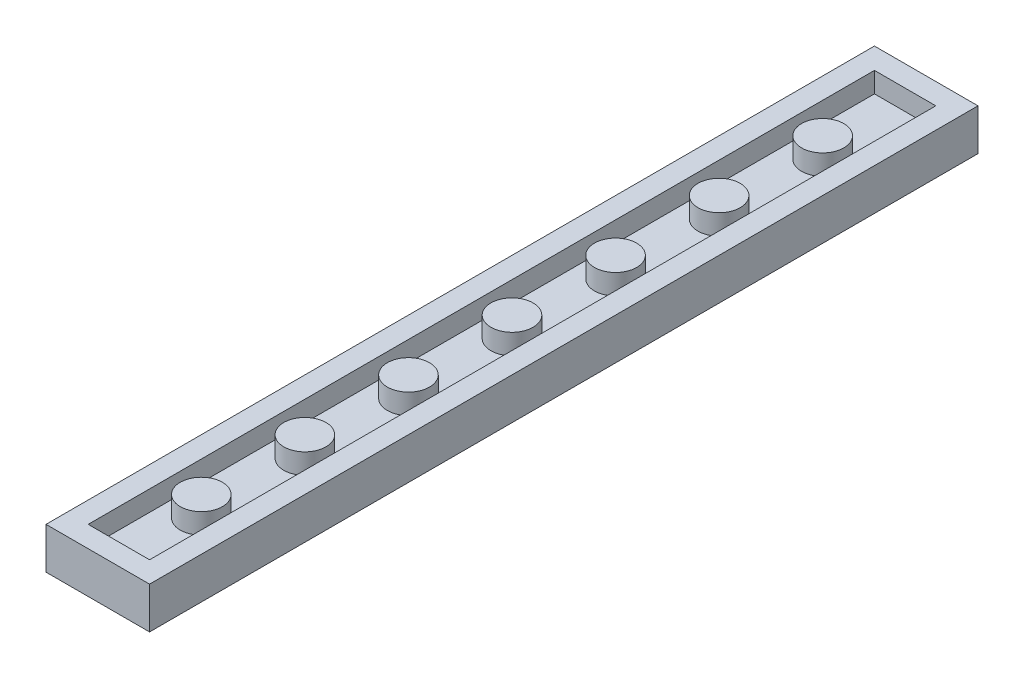
ISO-10303-21;
HEADER;
FILE_DESCRIPTION(('STEP AP214'),'2;1');
FILE_NAME('part.step','',(''),(''),'','','');
FILE_SCHEMA(('AUTOMOTIVE_DESIGN { 1 0 10303 214 1 1 1 1 }'));
ENDSEC;
DATA;
#1=APPLICATION_CONTEXT('core data for automotive mechanical design processes');
#2=APPLICATION_PROTOCOL_DEFINITION('international standard','automotive_design',2000,#1);
#3=PRODUCT_CONTEXT('',#1,'mechanical');
#4=PRODUCT('Part','Part','',(#3));
#5=PRODUCT_RELATED_PRODUCT_CATEGORY('part','',(#4));
#6=PRODUCT_DEFINITION_FORMATION('','',#4);
#7=PRODUCT_DEFINITION_CONTEXT('part definition',#1,'design');
#8=PRODUCT_DEFINITION('design','',#6,#7);
#9=PRODUCT_DEFINITION_SHAPE('','',#8);
#10=(LENGTH_UNIT() NAMED_UNIT(*) SI_UNIT(.MILLI.,.METRE.));
#11=(NAMED_UNIT(*) PLANE_ANGLE_UNIT() SI_UNIT($,.RADIAN.));
#12=(NAMED_UNIT(*) SI_UNIT($,.STERADIAN.) SOLID_ANGLE_UNIT());
#13=UNCERTAINTY_MEASURE_WITH_UNIT(LENGTH_MEASURE(1.E-05),#10,'distance_accuracy_value','');
#14=(GEOMETRIC_REPRESENTATION_CONTEXT(3) GLOBAL_UNCERTAINTY_ASSIGNED_CONTEXT((#13)) GLOBAL_UNIT_ASSIGNED_CONTEXT((#10,
#11,#12)) REPRESENTATION_CONTEXT('',''));
#15=CARTESIAN_POINT('',(0.,0.,0.));
#16=DIRECTION('',(0.,0.,1.));
#17=DIRECTION('',(1.,0.,0.));
#18=AXIS2_PLACEMENT_3D('',#15,#16,#17);
#19=CARTESIAN_POINT('',(-4.0325,0.,16.13));
#20=DIRECTION('',(0.,0.,1.));
#21=DIRECTION('',(1.,0.,0.));
#22=AXIS2_PLACEMENT_3D('',#19,#20,#21);
#23=PLANE('',#22);
#24=DIRECTION('',(1.,0.,0.));
#25=VECTOR('',#24,1.);
#26=CARTESIAN_POINT('',(-4.0325,3.226,16.13));
#27=LINE('',#26,#25);
#28=CARTESIAN_POINT('',(-4.0325,3.226,16.13));
#29=VERTEX_POINT('',#28);
#30=CARTESIAN_POINT('',(4.0325,3.226,16.13));
#31=VERTEX_POINT('',#30);
#32=EDGE_CURVE('E144',#29,#31,#27,.T.);
#33=ORIENTED_EDGE('',*,*,#32,.F.);
#34=DIRECTION('',(0.,1.,0.));
#35=VECTOR('',#34,1.);
#36=CARTESIAN_POINT('',(-4.0325,0.,16.13));
#37=LINE('',#36,#35);
#38=CARTESIAN_POINT('',(-4.0325,0.,16.13));
#39=VERTEX_POINT('',#38);
#40=EDGE_CURVE('E57',#39,#29,#37,.T.);
#41=ORIENTED_EDGE('',*,*,#40,.F.);
#42=DIRECTION('',(1.,0.,0.));
#43=VECTOR('',#42,1.);
#44=CARTESIAN_POINT('',(-4.0325,0.,16.13));
#45=LINE('',#44,#43);
#46=CARTESIAN_POINT('',(4.0325,0.,16.13));
#47=VERTEX_POINT('',#46);
#48=EDGE_CURVE('E148',#39,#47,#45,.T.);
#49=ORIENTED_EDGE('',*,*,#48,.T.);
#50=DIRECTION('',(0.,1.,0.));
#51=VECTOR('',#50,1.);
#52=CARTESIAN_POINT('',(4.0325,0.,16.13));
#53=LINE('',#52,#51);
#54=EDGE_CURVE('E83',#47,#31,#53,.T.);
#55=ORIENTED_EDGE('',*,*,#54,.T.);
#56=EDGE_LOOP('',(#33,#41,#49,#55));
#57=FACE_BOUND('',#56,.T.);
#58=ADVANCED_FACE('F34',(#57),#23,.T.);
#59=CARTESIAN_POINT('',(-4.03250000000001,0.,-48.39));
#60=DIRECTION('',(-1.,0.,0.));
#61=DIRECTION('',(0.,0.,1.));
#62=AXIS2_PLACEMENT_3D('',#59,#60,#61);
#63=PLANE('',#62);
#64=DIRECTION('',(0.,0.,1.));
#65=VECTOR('',#64,1.);
#66=CARTESIAN_POINT('',(-4.03250000000001,3.226,-48.39));
#67=LINE('',#66,#65);
#68=CARTESIAN_POINT('',(-4.03250000000001,3.226,-48.39));
#69=VERTEX_POINT('',#68);
#70=EDGE_CURVE('E151',#69,#29,#67,.T.);
#71=ORIENTED_EDGE('',*,*,#70,.F.);
#72=DIRECTION('',(0.,1.,0.));
#73=VECTOR('',#72,1.);
#74=CARTESIAN_POINT('',(-4.03250000000001,0.,-48.39));
#75=LINE('',#74,#73);
#76=CARTESIAN_POINT('',(-4.03250000000001,0.,-48.39));
#77=VERTEX_POINT('',#76);
#78=EDGE_CURVE('E170',#77,#69,#75,.T.);
#79=ORIENTED_EDGE('',*,*,#78,.F.);
#80=DIRECTION('',(0.,0.,1.));
#81=VECTOR('',#80,1.);
#82=CARTESIAN_POINT('',(-4.03250000000001,0.,-48.39));
#83=LINE('',#82,#81);
#84=EDGE_CURVE('E156',#77,#39,#83,.T.);
#85=ORIENTED_EDGE('',*,*,#84,.T.);
#86=ORIENTED_EDGE('',*,*,#40,.T.);
#87=EDGE_LOOP('',(#71,#79,#85,#86));
#88=FACE_BOUND('',#87,.T.);
#89=ADVANCED_FACE('F252',(#88),#63,.T.);
#90=CARTESIAN_POINT('',(4.0325,0.,-48.39));
#91=DIRECTION('',(0.,0.,-1.));
#92=DIRECTION('',(-1.,0.,0.));
#93=AXIS2_PLACEMENT_3D('',#90,#91,#92);
#94=PLANE('',#93);
#95=DIRECTION('',(-1.,0.,0.));
#96=VECTOR('',#95,1.);
#97=CARTESIAN_POINT('',(4.0325,3.226,-48.39));
#98=LINE('',#97,#96);
#99=CARTESIAN_POINT('',(4.0325,3.226,-48.39));
#100=VERTEX_POINT('',#99);
#101=EDGE_CURVE('E163',#100,#69,#98,.T.);
#102=ORIENTED_EDGE('',*,*,#101,.F.);
#103=DIRECTION('',(0.,1.,0.));
#104=VECTOR('',#103,1.);
#105=CARTESIAN_POINT('',(4.0325,0.,-48.39));
#106=LINE('',#105,#104);
#107=CARTESIAN_POINT('',(4.0325,0.,-48.39));
#108=VERTEX_POINT('',#107);
#109=EDGE_CURVE('E172',#108,#100,#106,.T.);
#110=ORIENTED_EDGE('',*,*,#109,.F.);
#111=DIRECTION('',(-1.,0.,0.));
#112=VECTOR('',#111,1.);
#113=CARTESIAN_POINT('',(4.0325,0.,-48.39));
#114=LINE('',#113,#112);
#115=EDGE_CURVE('E153',#108,#77,#114,.T.);
#116=ORIENTED_EDGE('',*,*,#115,.T.);
#117=ORIENTED_EDGE('',*,*,#78,.T.);
#118=EDGE_LOOP('',(#102,#110,#116,#117));
#119=FACE_BOUND('',#118,.T.);
#120=ADVANCED_FACE('F256',(#119),#94,.T.);
#121=CARTESIAN_POINT('',(4.0325,0.,16.13));
#122=DIRECTION('',(1.,0.,0.));
#123=DIRECTION('',(0.,0.,-1.));
#124=AXIS2_PLACEMENT_3D('',#121,#122,#123);
#125=PLANE('',#124);
#126=DIRECTION('',(0.,0.,-1.));
#127=VECTOR('',#126,1.);
#128=CARTESIAN_POINT('',(4.0325,3.226,16.13));
#129=LINE('',#128,#127);
#130=EDGE_CURVE('E160',#31,#100,#129,.T.);
#131=ORIENTED_EDGE('',*,*,#130,.F.);
#132=ORIENTED_EDGE('',*,*,#54,.F.);
#133=DIRECTION('',(0.,0.,-1.));
#134=VECTOR('',#133,1.);
#135=CARTESIAN_POINT('',(4.0325,0.,16.13));
#136=LINE('',#135,#134);
#137=EDGE_CURVE('E150',#47,#108,#136,.T.);
#138=ORIENTED_EDGE('',*,*,#137,.T.);
#139=ORIENTED_EDGE('',*,*,#109,.T.);
#140=EDGE_LOOP('',(#131,#132,#138,#139));
#141=FACE_BOUND('',#140,.T.);
#142=ADVANCED_FACE('F266',(#141),#125,.T.);
#143=CARTESIAN_POINT('',(0.,0.,0.));
#144=DIRECTION('',(0.,1.,0.));
#145=DIRECTION('',(0.,0.,1.));
#146=AXIS2_PLACEMENT_3D('',#143,#144,#145);
#147=PLANE('',#146);
#148=ORIENTED_EDGE('',*,*,#48,.F.);
#149=ORIENTED_EDGE('',*,*,#84,.F.);
#150=ORIENTED_EDGE('',*,*,#115,.F.);
#151=ORIENTED_EDGE('',*,*,#137,.F.);
#152=EDGE_LOOP('',(#148,#149,#150,#151));
#153=FACE_BOUND('',#152,.T.);
#154=ADVANCED_FACE('F265',(#153),#147,.F.);
#155=CARTESIAN_POINT('',(0.,3.226,0.));
#156=DIRECTION('',(0.,1.,0.));
#157=DIRECTION('',(0.,0.,1.));
#158=AXIS2_PLACEMENT_3D('',#155,#156,#157);
#159=PLANE('',#158);
#160=DIRECTION('',(0.,0.,1.));
#161=VECTOR('',#160,1.);
#162=CARTESIAN_POINT('',(-2.39,3.226,-14.4875));
#163=LINE('',#162,#161);
#164=CARTESIAN_POINT('',(-2.39,3.226,-46.7475));
#165=VERTEX_POINT('',#164);
#166=CARTESIAN_POINT('',(-2.39,3.226,14.4875));
#167=VERTEX_POINT('',#166);
#168=EDGE_CURVE('E111',#165,#167,#163,.T.);
#169=ORIENTED_EDGE('',*,*,#168,.F.);
#170=DIRECTION('',(-1.,0.,0.));
#171=VECTOR('',#170,1.);
#172=CARTESIAN_POINT('',(-2.39,3.226,-46.7475));
#173=LINE('',#172,#171);
#174=CARTESIAN_POINT('',(2.39,3.226,-46.7475));
#175=VERTEX_POINT('',#174);
#176=EDGE_CURVE('E127',#175,#165,#173,.T.);
#177=ORIENTED_EDGE('',*,*,#176,.F.);
#178=DIRECTION('',(0.,0.,-1.));
#179=VECTOR('',#178,1.);
#180=CARTESIAN_POINT('',(2.39,3.226,-46.7475));
#181=LINE('',#180,#179);
#182=CARTESIAN_POINT('',(2.39,3.226,14.4875));
#183=VERTEX_POINT('',#182);
#184=EDGE_CURVE('E137',#183,#175,#181,.T.);
#185=ORIENTED_EDGE('',*,*,#184,.F.);
#186=DIRECTION('',(1.,0.,0.));
#187=VECTOR('',#186,1.);
#188=CARTESIAN_POINT('',(-2.39,3.226,14.4875));
#189=LINE('',#188,#187);
#190=EDGE_CURVE('E135',#167,#183,#189,.T.);
#191=ORIENTED_EDGE('',*,*,#190,.F.);
#192=EDGE_LOOP('',(#169,#177,#185,#191));
#193=FACE_BOUND('',#192,.T.);
#194=ORIENTED_EDGE('',*,*,#32,.T.);
#195=ORIENTED_EDGE('',*,*,#130,.T.);
#196=ORIENTED_EDGE('',*,*,#101,.T.);
#197=ORIENTED_EDGE('',*,*,#70,.T.);
#198=EDGE_LOOP('',(#194,#195,#196,#197));
#199=FACE_BOUND('',#198,.T.);
#200=ADVANCED_FACE('F259',(#193,#199),#159,.T.);
#201=CARTESIAN_POINT('',(-2.39,1.6425,-14.4875));
#202=DIRECTION('',(-1.,0.,0.));
#203=DIRECTION('',(0.,0.,1.));
#204=AXIS2_PLACEMENT_3D('',#201,#202,#203);
#205=PLANE('',#204);
#206=ORIENTED_EDGE('',*,*,#168,.T.);
#207=DIRECTION('',(0.,1.,0.));
#208=VECTOR('',#207,1.);
#209=CARTESIAN_POINT('',(-2.39,1.6425,14.4875));
#210=LINE('',#209,#208);
#211=CARTESIAN_POINT('',(-2.39,1.6425,14.4875));
#212=VERTEX_POINT('',#211);
#213=EDGE_CURVE('E48',#212,#167,#210,.T.);
#214=ORIENTED_EDGE('',*,*,#213,.F.);
#215=DIRECTION('',(0.,0.,1.));
#216=VECTOR('',#215,1.);
#217=CARTESIAN_POINT('',(-2.39,1.6425,-14.4875));
#218=LINE('',#217,#216);
#219=CARTESIAN_POINT('',(-2.39,1.6425,-46.7475));
#220=VERTEX_POINT('',#219);
#221=EDGE_CURVE('E108',#220,#212,#218,.T.);
#222=ORIENTED_EDGE('',*,*,#221,.F.);
#223=DIRECTION('',(0.,1.,0.));
#224=VECTOR('',#223,1.);
#225=CARTESIAN_POINT('',(-2.39,1.6425,-46.7475));
#226=LINE('',#225,#224);
#227=EDGE_CURVE('E142',#220,#165,#226,.T.);
#228=ORIENTED_EDGE('',*,*,#227,.T.);
#229=EDGE_LOOP('',(#206,#214,#222,#228));
#230=FACE_BOUND('',#229,.T.);
#231=ADVANCED_FACE('F106',(#230),#205,.F.);
#232=CARTESIAN_POINT('',(-2.39,1.6425,-46.7475));
#233=DIRECTION('',(0.,0.,-1.));
#234=DIRECTION('',(-1.,0.,0.));
#235=AXIS2_PLACEMENT_3D('',#232,#233,#234);
#236=PLANE('',#235);
#237=ORIENTED_EDGE('',*,*,#176,.T.);
#238=ORIENTED_EDGE('',*,*,#227,.F.);
#239=DIRECTION('',(-1.,0.,0.));
#240=VECTOR('',#239,1.);
#241=CARTESIAN_POINT('',(-2.39,1.6425,-46.7475));
#242=LINE('',#241,#240);
#243=CARTESIAN_POINT('',(2.39,1.6425,-46.7475));
#244=VERTEX_POINT('',#243);
#245=EDGE_CURVE('E114',#244,#220,#242,.T.);
#246=ORIENTED_EDGE('',*,*,#245,.F.);
#247=DIRECTION('',(0.,1.,0.));
#248=VECTOR('',#247,1.);
#249=CARTESIAN_POINT('',(2.39,1.6425,-46.7475));
#250=LINE('',#249,#248);
#251=EDGE_CURVE('E145',#244,#175,#250,.T.);
#252=ORIENTED_EDGE('',*,*,#251,.T.);
#253=EDGE_LOOP('',(#237,#238,#246,#252));
#254=FACE_BOUND('',#253,.T.);
#255=ADVANCED_FACE('F283',(#254),#236,.F.);
#256=CARTESIAN_POINT('',(2.39,1.6425,-46.7475));
#257=DIRECTION('',(1.,0.,0.));
#258=DIRECTION('',(0.,0.,-1.));
#259=AXIS2_PLACEMENT_3D('',#256,#257,#258);
#260=PLANE('',#259);
#261=ORIENTED_EDGE('',*,*,#184,.T.);
#262=ORIENTED_EDGE('',*,*,#251,.F.);
#263=DIRECTION('',(0.,0.,-1.));
#264=VECTOR('',#263,1.);
#265=CARTESIAN_POINT('',(2.39,1.6425,14.4875));
#266=LINE('',#265,#264);
#267=CARTESIAN_POINT('',(2.39,1.6425,14.4875));
#268=VERTEX_POINT('',#267);
#269=EDGE_CURVE('E121',#268,#244,#266,.T.);
#270=ORIENTED_EDGE('',*,*,#269,.F.);
#271=DIRECTION('',(0.,1.,0.));
#272=VECTOR('',#271,1.);
#273=CARTESIAN_POINT('',(2.39,1.6425,14.4875));
#274=LINE('',#273,#272);
#275=EDGE_CURVE('E113',#268,#183,#274,.T.);
#276=ORIENTED_EDGE('',*,*,#275,.T.);
#277=EDGE_LOOP('',(#261,#262,#270,#276));
#278=FACE_BOUND('',#277,.T.);
#279=ADVANCED_FACE('F280',(#278),#260,.F.);
#280=CARTESIAN_POINT('',(-2.39,1.6425,14.4875));
#281=DIRECTION('',(0.,0.,1.));
#282=DIRECTION('',(1.,0.,0.));
#283=AXIS2_PLACEMENT_3D('',#280,#281,#282);
#284=PLANE('',#283);
#285=ORIENTED_EDGE('',*,*,#190,.T.);
#286=ORIENTED_EDGE('',*,*,#275,.F.);
#287=DIRECTION('',(1.,0.,0.));
#288=VECTOR('',#287,1.);
#289=CARTESIAN_POINT('',(-2.39,1.6425,14.4875));
#290=LINE('',#289,#288);
#291=EDGE_CURVE('E117',#212,#268,#290,.T.);
#292=ORIENTED_EDGE('',*,*,#291,.F.);
#293=ORIENTED_EDGE('',*,*,#213,.T.);
#294=EDGE_LOOP('',(#285,#286,#292,#293));
#295=FACE_BOUND('',#294,.T.);
#296=ADVANCED_FACE('F118',(#295),#284,.F.);
#297=CARTESIAN_POINT('',(0.,1.6425,0.));
#298=DIRECTION('',(0.,1.,0.));
#299=DIRECTION('',(0.,0.,1.));
#300=AXIS2_PLACEMENT_3D('',#297,#298,#299);
#301=PLANE('',#300);
#302=CARTESIAN_POINT('',(0.,1.6425,-40.325));
#303=DIRECTION('',(0.,1.,0.));
#304=DIRECTION('',(0.,0.,1.));
#305=AXIS2_PLACEMENT_3D('',#302,#303,#304);
#306=CIRCLE('',#305,1.6425);
#307=CARTESIAN_POINT('',(0.,1.6425,-38.6825));
#308=VERTEX_POINT('',#307);
#309=EDGE_CURVE('E11',#308,#308,#306,.T.);
#310=ORIENTED_EDGE('',*,*,#309,.F.);
#311=EDGE_LOOP('',(#310));
#312=FACE_BOUND('',#311,.T.);
#313=CARTESIAN_POINT('',(0.,1.6425,-32.26));
#314=DIRECTION('',(0.,1.,0.));
#315=DIRECTION('',(0.,0.,1.));
#316=AXIS2_PLACEMENT_3D('',#313,#314,#315);
#317=CIRCLE('',#316,1.6425);
#318=CARTESIAN_POINT('',(0.,1.6425,-30.6175));
#319=VERTEX_POINT('',#318);
#320=EDGE_CURVE('E41',#319,#319,#317,.T.);
#321=ORIENTED_EDGE('',*,*,#320,.F.);
#322=EDGE_LOOP('',(#321));
#323=FACE_BOUND('',#322,.T.);
#324=CARTESIAN_POINT('',(0.,1.6425,-24.195));
#325=DIRECTION('',(0.,1.,0.));
#326=DIRECTION('',(0.,0.,1.));
#327=AXIS2_PLACEMENT_3D('',#324,#325,#326);
#328=CIRCLE('',#327,1.6425);
#329=CARTESIAN_POINT('',(0.,1.6425,-22.5525));
#330=VERTEX_POINT('',#329);
#331=EDGE_CURVE('E186',#330,#330,#328,.T.);
#332=ORIENTED_EDGE('',*,*,#331,.F.);
#333=EDGE_LOOP('',(#332));
#334=FACE_BOUND('',#333,.T.);
#335=CARTESIAN_POINT('',(0.,1.6425,-16.13));
#336=DIRECTION('',(0.,1.,0.));
#337=DIRECTION('',(0.,0.,1.));
#338=AXIS2_PLACEMENT_3D('',#335,#336,#337);
#339=CIRCLE('',#338,1.6425);
#340=CARTESIAN_POINT('',(0.,1.6425,-14.4875));
#341=VERTEX_POINT('',#340);
#342=EDGE_CURVE('E183',#341,#341,#339,.T.);
#343=ORIENTED_EDGE('',*,*,#342,.F.);
#344=EDGE_LOOP('',(#343));
#345=FACE_BOUND('',#344,.T.);
#346=CARTESIAN_POINT('',(0.,1.6425,8.065));
#347=DIRECTION('',(0.,1.,0.));
#348=DIRECTION('',(0.,0.,1.));
#349=AXIS2_PLACEMENT_3D('',#346,#347,#348);
#350=CIRCLE('',#349,1.6425);
#351=CARTESIAN_POINT('',(0.,1.6425,9.7075));
#352=VERTEX_POINT('',#351);
#353=EDGE_CURVE('E180',#352,#352,#350,.T.);
#354=ORIENTED_EDGE('',*,*,#353,.F.);
#355=EDGE_LOOP('',(#354));
#356=FACE_BOUND('',#355,.T.);
#357=CARTESIAN_POINT('',(0.,1.6425,0.));
#358=DIRECTION('',(0.,1.,0.));
#359=DIRECTION('',(0.,0.,1.));
#360=AXIS2_PLACEMENT_3D('',#357,#358,#359);
#361=CIRCLE('',#360,1.6425);
#362=CARTESIAN_POINT('',(0.,1.6425,1.6425));
#363=VERTEX_POINT('',#362);
#364=EDGE_CURVE('E177',#363,#363,#361,.T.);
#365=ORIENTED_EDGE('',*,*,#364,.F.);
#366=EDGE_LOOP('',(#365));
#367=FACE_BOUND('',#366,.T.);
#368=CARTESIAN_POINT('',(0.,1.6425,-8.065));
#369=DIRECTION('',(0.,1.,0.));
#370=DIRECTION('',(0.,0.,1.));
#371=AXIS2_PLACEMENT_3D('',#368,#369,#370);
#372=CIRCLE('',#371,1.6425);
#373=CARTESIAN_POINT('',(0.,1.6425,-6.4225));
#374=VERTEX_POINT('',#373);
#375=EDGE_CURVE('E169',#374,#374,#372,.T.);
#376=ORIENTED_EDGE('',*,*,#375,.F.);
#377=EDGE_LOOP('',(#376));
#378=FACE_BOUND('',#377,.T.);
#379=ORIENTED_EDGE('',*,*,#221,.T.);
#380=ORIENTED_EDGE('',*,*,#291,.T.);
#381=ORIENTED_EDGE('',*,*,#269,.T.);
#382=ORIENTED_EDGE('',*,*,#245,.T.);
#383=EDGE_LOOP('',(#379,#380,#381,#382));
#384=FACE_BOUND('',#383,.T.);
#385=ADVANCED_FACE('F124',(#312,#323,#334,#345,#356,#367,#378,#384),#301,.T.);
#386=CARTESIAN_POINT('',(0.,1.6425,-8.065));
#387=DIRECTION('',(0.,1.,0.));
#388=DIRECTION('',(0.,0.,1.));
#389=AXIS2_PLACEMENT_3D('',#386,#387,#388);
#390=CYLINDRICAL_SURFACE('',#389,1.6425);
#391=ORIENTED_EDGE('',*,*,#375,.T.);
#392=EDGE_LOOP('',(#391));
#393=FACE_BOUND('',#392,.T.);
#394=CARTESIAN_POINT('',(0.,3.22600000000043,-8.065));
#395=DIRECTION('',(0.,1.,0.));
#396=DIRECTION('',(0.,0.,1.));
#397=AXIS2_PLACEMENT_3D('',#394,#395,#396);
#398=CIRCLE('',#397,1.6425);
#399=CARTESIAN_POINT('',(0.,3.22600000000043,-6.4225));
#400=VERTEX_POINT('',#399);
#401=EDGE_CURVE('E130',#400,#400,#398,.T.);
#402=ORIENTED_EDGE('',*,*,#401,.F.);
#403=EDGE_LOOP('',(#402));
#404=FACE_BOUND('',#403,.T.);
#405=ADVANCED_FACE('F196',(#393,#404),#390,.T.);
#406=CARTESIAN_POINT('',(0.,3.22600000000043,-8.065));
#407=DIRECTION('',(0.,1.,0.));
#408=DIRECTION('',(0.,0.,1.));
#409=AXIS2_PLACEMENT_3D('',#406,#407,#408);
#410=PLANE('',#409);
#411=ORIENTED_EDGE('',*,*,#401,.T.);
#412=EDGE_LOOP('',(#411));
#413=FACE_BOUND('',#412,.T.);
#414=ADVANCED_FACE('F211',(#413),#410,.T.);
#415=CARTESIAN_POINT('',(0.,1.6425,0.));
#416=DIRECTION('',(0.,1.,0.));
#417=DIRECTION('',(0.,0.,1.));
#418=AXIS2_PLACEMENT_3D('',#415,#416,#417);
#419=CYLINDRICAL_SURFACE('',#418,1.6425);
#420=ORIENTED_EDGE('',*,*,#364,.T.);
#421=EDGE_LOOP('',(#420));
#422=FACE_BOUND('',#421,.T.);
#423=CARTESIAN_POINT('',(0.,3.22600000000043,0.));
#424=DIRECTION('',(0.,1.,0.));
#425=DIRECTION('',(0.,0.,1.));
#426=AXIS2_PLACEMENT_3D('',#423,#424,#425);
#427=CIRCLE('',#426,1.6425);
#428=CARTESIAN_POINT('',(0.,3.22600000000043,1.6425));
#429=VERTEX_POINT('',#428);
#430=EDGE_CURVE('E216',#429,#429,#427,.T.);
#431=ORIENTED_EDGE('',*,*,#430,.F.);
#432=EDGE_LOOP('',(#431));
#433=FACE_BOUND('',#432,.T.);
#434=ADVANCED_FACE('F292',(#422,#433),#419,.T.);
#435=CARTESIAN_POINT('',(0.,3.22600000000043,0.));
#436=DIRECTION('',(0.,1.,0.));
#437=DIRECTION('',(0.,0.,1.));
#438=AXIS2_PLACEMENT_3D('',#435,#436,#437);
#439=PLANE('',#438);
#440=ORIENTED_EDGE('',*,*,#430,.T.);
#441=EDGE_LOOP('',(#440));
#442=FACE_BOUND('',#441,.T.);
#443=ADVANCED_FACE('F295',(#442),#439,.T.);
#444=CARTESIAN_POINT('',(0.,1.6425,8.065));
#445=DIRECTION('',(0.,1.,0.));
#446=DIRECTION('',(0.,0.,1.));
#447=AXIS2_PLACEMENT_3D('',#444,#445,#446);
#448=CYLINDRICAL_SURFACE('',#447,1.6425);
#449=ORIENTED_EDGE('',*,*,#353,.T.);
#450=EDGE_LOOP('',(#449));
#451=FACE_BOUND('',#450,.T.);
#452=CARTESIAN_POINT('',(0.,3.22600000000043,8.065));
#453=DIRECTION('',(0.,1.,0.));
#454=DIRECTION('',(0.,0.,1.));
#455=AXIS2_PLACEMENT_3D('',#452,#453,#454);
#456=CIRCLE('',#455,1.6425);
#457=CARTESIAN_POINT('',(0.,3.22600000000043,9.7075));
#458=VERTEX_POINT('',#457);
#459=EDGE_CURVE('E218',#458,#458,#456,.T.);
#460=ORIENTED_EDGE('',*,*,#459,.F.);
#461=EDGE_LOOP('',(#460));
#462=FACE_BOUND('',#461,.T.);
#463=ADVANCED_FACE('F299',(#451,#462),#448,.T.);
#464=CARTESIAN_POINT('',(0.,3.22600000000043,8.065));
#465=DIRECTION('',(0.,1.,0.));
#466=DIRECTION('',(0.,0.,1.));
#467=AXIS2_PLACEMENT_3D('',#464,#465,#466);
#468=PLANE('',#467);
#469=ORIENTED_EDGE('',*,*,#459,.T.);
#470=EDGE_LOOP('',(#469));
#471=FACE_BOUND('',#470,.T.);
#472=ADVANCED_FACE('F302',(#471),#468,.T.);
#473=CARTESIAN_POINT('',(0.,1.6425,-16.13));
#474=DIRECTION('',(0.,1.,0.));
#475=DIRECTION('',(0.,0.,1.));
#476=AXIS2_PLACEMENT_3D('',#473,#474,#475);
#477=CYLINDRICAL_SURFACE('',#476,1.6425);
#478=ORIENTED_EDGE('',*,*,#342,.T.);
#479=EDGE_LOOP('',(#478));
#480=FACE_BOUND('',#479,.T.);
#481=CARTESIAN_POINT('',(0.,3.22600000000043,-16.13));
#482=DIRECTION('',(0.,1.,0.));
#483=DIRECTION('',(0.,0.,1.));
#484=AXIS2_PLACEMENT_3D('',#481,#482,#483);
#485=CIRCLE('',#484,1.6425);
#486=CARTESIAN_POINT('',(0.,3.22600000000043,-14.4875));
#487=VERTEX_POINT('',#486);
#488=EDGE_CURVE('E222',#487,#487,#485,.T.);
#489=ORIENTED_EDGE('',*,*,#488,.F.);
#490=EDGE_LOOP('',(#489));
#491=FACE_BOUND('',#490,.T.);
#492=ADVANCED_FACE('F306',(#480,#491),#477,.T.);
#493=CARTESIAN_POINT('',(0.,3.22600000000043,-16.13));
#494=DIRECTION('',(0.,1.,0.));
#495=DIRECTION('',(0.,0.,1.));
#496=AXIS2_PLACEMENT_3D('',#493,#494,#495);
#497=PLANE('',#496);
#498=ORIENTED_EDGE('',*,*,#488,.T.);
#499=EDGE_LOOP('',(#498));
#500=FACE_BOUND('',#499,.T.);
#501=ADVANCED_FACE('F310',(#500),#497,.T.);
#502=CARTESIAN_POINT('',(0.,1.6425,-24.195));
#503=DIRECTION('',(0.,1.,0.));
#504=DIRECTION('',(0.,0.,1.));
#505=AXIS2_PLACEMENT_3D('',#502,#503,#504);
#506=CYLINDRICAL_SURFACE('',#505,1.6425);
#507=ORIENTED_EDGE('',*,*,#331,.T.);
#508=EDGE_LOOP('',(#507));
#509=FACE_BOUND('',#508,.T.);
#510=CARTESIAN_POINT('',(0.,3.22600000000043,-24.195));
#511=DIRECTION('',(0.,1.,0.));
#512=DIRECTION('',(0.,0.,1.));
#513=AXIS2_PLACEMENT_3D('',#510,#511,#512);
#514=CIRCLE('',#513,1.6425);
#515=CARTESIAN_POINT('',(0.,3.22600000000043,-22.5525));
#516=VERTEX_POINT('',#515);
#517=EDGE_CURVE('E227',#516,#516,#514,.T.);
#518=ORIENTED_EDGE('',*,*,#517,.F.);
#519=EDGE_LOOP('',(#518));
#520=FACE_BOUND('',#519,.T.);
#521=ADVANCED_FACE('F314',(#509,#520),#506,.T.);
#522=CARTESIAN_POINT('',(0.,3.22600000000043,-24.195));
#523=DIRECTION('',(0.,1.,0.));
#524=DIRECTION('',(0.,0.,1.));
#525=AXIS2_PLACEMENT_3D('',#522,#523,#524);
#526=PLANE('',#525);
#527=ORIENTED_EDGE('',*,*,#517,.T.);
#528=EDGE_LOOP('',(#527));
#529=FACE_BOUND('',#528,.T.);
#530=ADVANCED_FACE('F318',(#529),#526,.T.);
#531=CARTESIAN_POINT('',(0.,1.6425,-32.26));
#532=DIRECTION('',(0.,1.,0.));
#533=DIRECTION('',(0.,0.,1.));
#534=AXIS2_PLACEMENT_3D('',#531,#532,#533);
#535=CYLINDRICAL_SURFACE('',#534,1.6425);
#536=ORIENTED_EDGE('',*,*,#320,.T.);
#537=EDGE_LOOP('',(#536));
#538=FACE_BOUND('',#537,.T.);
#539=CARTESIAN_POINT('',(0.,3.22600000000043,-32.26));
#540=DIRECTION('',(0.,1.,0.));
#541=DIRECTION('',(0.,0.,1.));
#542=AXIS2_PLACEMENT_3D('',#539,#540,#541);
#543=CIRCLE('',#542,1.6425);
#544=CARTESIAN_POINT('',(0.,3.22600000000043,-30.6175));
#545=VERTEX_POINT('',#544);
#546=EDGE_CURVE('E230',#545,#545,#543,.T.);
#547=ORIENTED_EDGE('',*,*,#546,.F.);
#548=EDGE_LOOP('',(#547));
#549=FACE_BOUND('',#548,.T.);
#550=ADVANCED_FACE('F191',(#538,#549),#535,.T.);
#551=CARTESIAN_POINT('',(0.,3.22600000000043,-32.26));
#552=DIRECTION('',(0.,1.,0.));
#553=DIRECTION('',(0.,0.,1.));
#554=AXIS2_PLACEMENT_3D('',#551,#552,#553);
#555=PLANE('',#554);
#556=ORIENTED_EDGE('',*,*,#546,.T.);
#557=EDGE_LOOP('',(#556));
#558=FACE_BOUND('',#557,.T.);
#559=ADVANCED_FACE('F241',(#558),#555,.T.);
#560=CARTESIAN_POINT('',(0.,1.6425,-40.325));
#561=DIRECTION('',(0.,1.,0.));
#562=DIRECTION('',(0.,0.,1.));
#563=AXIS2_PLACEMENT_3D('',#560,#561,#562);
#564=CYLINDRICAL_SURFACE('',#563,1.6425);
#565=ORIENTED_EDGE('',*,*,#309,.T.);
#566=EDGE_LOOP('',(#565));
#567=FACE_BOUND('',#566,.T.);
#568=CARTESIAN_POINT('',(0.,3.22600000000043,-40.325));
#569=DIRECTION('',(0.,1.,0.));
#570=DIRECTION('',(0.,0.,1.));
#571=AXIS2_PLACEMENT_3D('',#568,#569,#570);
#572=CIRCLE('',#571,1.6425);
#573=CARTESIAN_POINT('',(0.,3.22600000000043,-38.6825));
#574=VERTEX_POINT('',#573);
#575=EDGE_CURVE('E233',#574,#574,#572,.T.);
#576=ORIENTED_EDGE('',*,*,#575,.F.);
#577=EDGE_LOOP('',(#576));
#578=FACE_BOUND('',#577,.T.);
#579=ADVANCED_FACE('F239',(#567,#578),#564,.T.);
#580=CARTESIAN_POINT('',(0.,3.22600000000043,-40.325));
#581=DIRECTION('',(0.,1.,0.));
#582=DIRECTION('',(0.,0.,1.));
#583=AXIS2_PLACEMENT_3D('',#580,#581,#582);
#584=PLANE('',#583);
#585=ORIENTED_EDGE('',*,*,#575,.T.);
#586=EDGE_LOOP('',(#585));
#587=FACE_BOUND('',#586,.T.);
#588=ADVANCED_FACE('F237',(#587),#584,.T.);
#589=CLOSED_SHELL('',(#58,#89,#120,#142,#154,#200,#231,#255,#279,#296,#385,#405,#414,#434,#443,
#463,#472,#492,#501,#521,#530,#550,#559,#579,#588));
#590=MANIFOLD_SOLID_BREP('B2',#589);
#591=ADVANCED_BREP_SHAPE_REPRESENTATION('',(#18,#590),#14);
#592=SHAPE_DEFINITION_REPRESENTATION(#9,#591);
ENDSEC;
END-ISO-10303-21;
